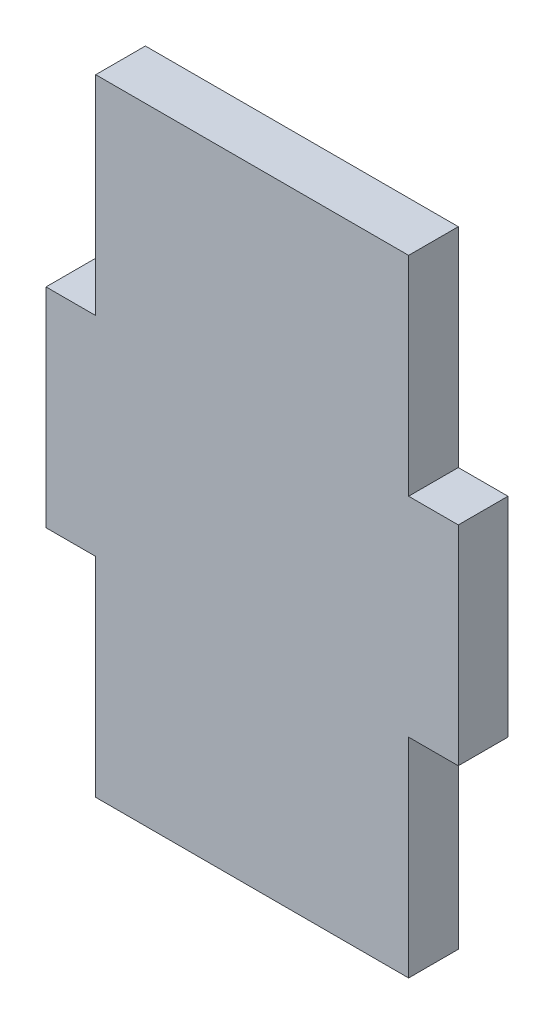
ISO-10303-21;
HEADER;
FILE_DESCRIPTION(('STEP AP214'),'2;1');
FILE_NAME('part.step','',(''),(''),'','','');
FILE_SCHEMA(('AUTOMOTIVE_DESIGN { 1 0 10303 214 1 1 1 1 }'));
ENDSEC;
DATA;
#1=APPLICATION_CONTEXT('core data for automotive mechanical design processes');
#2=APPLICATION_PROTOCOL_DEFINITION('international standard','automotive_design',2000,#1);
#3=PRODUCT_CONTEXT('',#1,'mechanical');
#4=PRODUCT('Part','Part','',(#3));
#5=PRODUCT_RELATED_PRODUCT_CATEGORY('part','',(#4));
#6=PRODUCT_DEFINITION_FORMATION('','',#4);
#7=PRODUCT_DEFINITION_CONTEXT('part definition',#1,'design');
#8=PRODUCT_DEFINITION('design','',#6,#7);
#9=PRODUCT_DEFINITION_SHAPE('','',#8);
#10=(LENGTH_UNIT() NAMED_UNIT(*) SI_UNIT(.MILLI.,.METRE.));
#11=(NAMED_UNIT(*) PLANE_ANGLE_UNIT() SI_UNIT($,.RADIAN.));
#12=(NAMED_UNIT(*) SI_UNIT($,.STERADIAN.) SOLID_ANGLE_UNIT());
#13=UNCERTAINTY_MEASURE_WITH_UNIT(LENGTH_MEASURE(1.E-05),#10,'distance_accuracy_value','');
#14=(GEOMETRIC_REPRESENTATION_CONTEXT(3) GLOBAL_UNCERTAINTY_ASSIGNED_CONTEXT((#13)) GLOBAL_UNIT_ASSIGNED_CONTEXT((#10,
#11,#12)) REPRESENTATION_CONTEXT('',''));
#15=CARTESIAN_POINT('',(0.,0.,0.));
#16=DIRECTION('',(0.,0.,1.));
#17=DIRECTION('',(1.,0.,0.));
#18=AXIS2_PLACEMENT_3D('',#15,#16,#17);
#19=CARTESIAN_POINT('',(0.,0.,3.175));
#20=DIRECTION('',(1.,0.,0.));
#21=DIRECTION('',(0.,0.,-1.));
#22=AXIS2_PLACEMENT_3D('',#19,#20,#21);
#23=PLANE('',#22);
#24=DIRECTION('',(0.,-1.,0.));
#25=VECTOR('',#24,1.);
#26=CARTESIAN_POINT('',(0.,0.,0.));
#27=LINE('',#26,#25);
#28=CARTESIAN_POINT('',(0.,13.3333333333333,0.));
#29=VERTEX_POINT('',#28);
#30=CARTESIAN_POINT('',(0.,0.,0.));
#31=VERTEX_POINT('',#30);
#32=EDGE_CURVE('E153',#29,#31,#27,.T.);
#33=ORIENTED_EDGE('',*,*,#32,.T.);
#34=DIRECTION('',(0.,0.,-1.));
#35=VECTOR('',#34,1.);
#36=CARTESIAN_POINT('',(0.,0.,3.175));
#37=LINE('',#36,#35);
#38=CARTESIAN_POINT('',(0.,0.,3.175));
#39=VERTEX_POINT('',#38);
#40=EDGE_CURVE('E11',#39,#31,#37,.T.);
#41=ORIENTED_EDGE('',*,*,#40,.F.);
#42=DIRECTION('',(0.,-1.,0.));
#43=VECTOR('',#42,1.);
#44=CARTESIAN_POINT('',(0.,0.,3.175));
#45=LINE('',#44,#43);
#46=CARTESIAN_POINT('',(0.,13.3333333333333,3.175));
#47=VERTEX_POINT('',#46);
#48=EDGE_CURVE('E175',#47,#39,#45,.T.);
#49=ORIENTED_EDGE('',*,*,#48,.F.);
#50=DIRECTION('',(0.,0.,-1.));
#51=VECTOR('',#50,1.);
#52=CARTESIAN_POINT('',(0.,13.3333333333333,3.175));
#53=LINE('',#52,#51);
#54=EDGE_CURVE('E149',#47,#29,#53,.T.);
#55=ORIENTED_EDGE('',*,*,#54,.T.);
#56=EDGE_LOOP('',(#33,#41,#49,#55));
#57=FACE_BOUND('',#56,.T.);
#58=ADVANCED_FACE('F33',(#57),#23,.F.);
#59=CARTESIAN_POINT('',(0.,0.,3.175));
#60=DIRECTION('',(0.,1.,0.));
#61=DIRECTION('',(0.,0.,1.));
#62=AXIS2_PLACEMENT_3D('',#59,#60,#61);
#63=PLANE('',#62);
#64=DIRECTION('',(1.,0.,0.));
#65=VECTOR('',#64,1.);
#66=CARTESIAN_POINT('',(0.,0.,0.));
#67=LINE('',#66,#65);
#68=CARTESIAN_POINT('',(20.,0.,0.));
#69=VERTEX_POINT('',#68);
#70=EDGE_CURVE('E156',#31,#69,#67,.T.);
#71=ORIENTED_EDGE('',*,*,#70,.T.);
#72=DIRECTION('',(0.,0.,-1.));
#73=VECTOR('',#72,1.);
#74=CARTESIAN_POINT('',(20.,0.,3.175));
#75=LINE('',#74,#73);
#76=CARTESIAN_POINT('',(20.,0.,3.175));
#77=VERTEX_POINT('',#76);
#78=EDGE_CURVE('E41',#77,#69,#75,.T.);
#79=ORIENTED_EDGE('',*,*,#78,.F.);
#80=DIRECTION('',(1.,0.,0.));
#81=VECTOR('',#80,1.);
#82=CARTESIAN_POINT('',(0.,0.,3.175));
#83=LINE('',#82,#81);
#84=EDGE_CURVE('E104',#39,#77,#83,.T.);
#85=ORIENTED_EDGE('',*,*,#84,.F.);
#86=ORIENTED_EDGE('',*,*,#40,.T.);
#87=EDGE_LOOP('',(#71,#79,#85,#86));
#88=FACE_BOUND('',#87,.T.);
#89=ADVANCED_FACE('F253',(#88),#63,.F.);
#90=CARTESIAN_POINT('',(20.,0.,3.175));
#91=DIRECTION('',(-1.,0.,0.));
#92=DIRECTION('',(0.,0.,1.));
#93=AXIS2_PLACEMENT_3D('',#90,#91,#92);
#94=PLANE('',#93);
#95=DIRECTION('',(0.,1.,0.));
#96=VECTOR('',#95,1.);
#97=CARTESIAN_POINT('',(20.,0.,0.));
#98=LINE('',#97,#96);
#99=CARTESIAN_POINT('',(20.,13.3333333333333,0.));
#100=VERTEX_POINT('',#99);
#101=EDGE_CURVE('E158',#69,#100,#98,.T.);
#102=ORIENTED_EDGE('',*,*,#101,.T.);
#103=DIRECTION('',(0.,0.,-1.));
#104=VECTOR('',#103,1.);
#105=CARTESIAN_POINT('',(20.,13.3333333333333,3.175));
#106=LINE('',#105,#104);
#107=CARTESIAN_POINT('',(20.,13.3333333333333,3.175));
#108=VERTEX_POINT('',#107);
#109=EDGE_CURVE('E194',#108,#100,#106,.T.);
#110=ORIENTED_EDGE('',*,*,#109,.F.);
#111=DIRECTION('',(0.,1.,0.));
#112=VECTOR('',#111,1.);
#113=CARTESIAN_POINT('',(20.,0.,3.175));
#114=LINE('',#113,#112);
#115=EDGE_CURVE('E202',#77,#108,#114,.T.);
#116=ORIENTED_EDGE('',*,*,#115,.F.);
#117=ORIENTED_EDGE('',*,*,#78,.T.);
#118=EDGE_LOOP('',(#102,#110,#116,#117));
#119=FACE_BOUND('',#118,.T.);
#120=ADVANCED_FACE('F200',(#119),#94,.F.);
#121=CARTESIAN_POINT('',(23.175,13.3333333333333,3.175));
#122=DIRECTION('',(0.,1.,0.));
#123=DIRECTION('',(-1.,0.,0.));
#124=AXIS2_PLACEMENT_3D('',#121,#122,#123);
#125=PLANE('',#124);
#126=DIRECTION('',(1.,0.,0.));
#127=VECTOR('',#126,1.);
#128=CARTESIAN_POINT('',(23.175,13.3333333333333,0.));
#129=LINE('',#128,#127);
#130=CARTESIAN_POINT('',(23.175,13.3333333333333,0.));
#131=VERTEX_POINT('',#130);
#132=EDGE_CURVE('E160',#100,#131,#129,.T.);
#133=ORIENTED_EDGE('',*,*,#132,.T.);
#134=DIRECTION('',(0.,0.,-1.));
#135=VECTOR('',#134,1.);
#136=CARTESIAN_POINT('',(23.175,13.3333333333333,3.175));
#137=LINE('',#136,#135);
#138=CARTESIAN_POINT('',(23.175,13.3333333333333,3.175));
#139=VERTEX_POINT('',#138);
#140=EDGE_CURVE('E191',#139,#131,#137,.T.);
#141=ORIENTED_EDGE('',*,*,#140,.F.);
#142=DIRECTION('',(1.,0.,0.));
#143=VECTOR('',#142,1.);
#144=CARTESIAN_POINT('',(23.175,13.3333333333333,3.175));
#145=LINE('',#144,#143);
#146=EDGE_CURVE('E220',#108,#139,#145,.T.);
#147=ORIENTED_EDGE('',*,*,#146,.F.);
#148=ORIENTED_EDGE('',*,*,#109,.T.);
#149=EDGE_LOOP('',(#133,#141,#147,#148));
#150=FACE_BOUND('',#149,.T.);
#151=ADVANCED_FACE('F211',(#150),#125,.F.);
#152=CARTESIAN_POINT('',(23.175,26.6666666666667,3.175));
#153=DIRECTION('',(-1.,0.,0.));
#154=DIRECTION('',(0.,0.,1.));
#155=AXIS2_PLACEMENT_3D('',#152,#153,#154);
#156=PLANE('',#155);
#157=DIRECTION('',(0.,1.,0.));
#158=VECTOR('',#157,1.);
#159=CARTESIAN_POINT('',(23.175,26.6666666666667,0.));
#160=LINE('',#159,#158);
#161=CARTESIAN_POINT('',(23.175,26.6666666666667,0.));
#162=VERTEX_POINT('',#161);
#163=EDGE_CURVE('E162',#131,#162,#160,.T.);
#164=ORIENTED_EDGE('',*,*,#163,.T.);
#165=DIRECTION('',(0.,0.,-1.));
#166=VECTOR('',#165,1.);
#167=CARTESIAN_POINT('',(23.175,26.6666666666667,3.175));
#168=LINE('',#167,#166);
#169=CARTESIAN_POINT('',(23.175,26.6666666666667,3.175));
#170=VERTEX_POINT('',#169);
#171=EDGE_CURVE('E188',#170,#162,#168,.T.);
#172=ORIENTED_EDGE('',*,*,#171,.F.);
#173=DIRECTION('',(0.,1.,0.));
#174=VECTOR('',#173,1.);
#175=CARTESIAN_POINT('',(23.175,26.6666666666667,3.175));
#176=LINE('',#175,#174);
#177=EDGE_CURVE('E217',#139,#170,#176,.T.);
#178=ORIENTED_EDGE('',*,*,#177,.F.);
#179=ORIENTED_EDGE('',*,*,#140,.T.);
#180=EDGE_LOOP('',(#164,#172,#178,#179));
#181=FACE_BOUND('',#180,.T.);
#182=ADVANCED_FACE('F215',(#181),#156,.F.);
#183=CARTESIAN_POINT('',(20.,26.6666666666667,3.175));
#184=DIRECTION('',(0.,-1.,0.));
#185=DIRECTION('',(0.,0.,-1.));
#186=AXIS2_PLACEMENT_3D('',#183,#184,#185);
#187=PLANE('',#186);
#188=DIRECTION('',(-1.,0.,0.));
#189=VECTOR('',#188,1.);
#190=CARTESIAN_POINT('',(20.,26.6666666666667,0.));
#191=LINE('',#190,#189);
#192=CARTESIAN_POINT('',(20.,26.6666666666667,0.));
#193=VERTEX_POINT('',#192);
#194=EDGE_CURVE('E164',#162,#193,#191,.T.);
#195=ORIENTED_EDGE('',*,*,#194,.T.);
#196=DIRECTION('',(0.,0.,-1.));
#197=VECTOR('',#196,1.);
#198=CARTESIAN_POINT('',(20.,26.6666666666667,3.175));
#199=LINE('',#198,#197);
#200=CARTESIAN_POINT('',(20.,26.6666666666667,3.175));
#201=VERTEX_POINT('',#200);
#202=EDGE_CURVE('E185',#201,#193,#199,.T.);
#203=ORIENTED_EDGE('',*,*,#202,.F.);
#204=DIRECTION('',(-1.,0.,0.));
#205=VECTOR('',#204,1.);
#206=CARTESIAN_POINT('',(20.,26.6666666666667,3.175));
#207=LINE('',#206,#205);
#208=EDGE_CURVE('E219',#170,#201,#207,.T.);
#209=ORIENTED_EDGE('',*,*,#208,.F.);
#210=ORIENTED_EDGE('',*,*,#171,.T.);
#211=EDGE_LOOP('',(#195,#203,#209,#210));
#212=FACE_BOUND('',#211,.T.);
#213=ADVANCED_FACE('F266',(#212),#187,.F.);
#214=CARTESIAN_POINT('',(20.,26.6666666666667,3.175));
#215=DIRECTION('',(-1.,0.,0.));
#216=DIRECTION('',(0.,0.,1.));
#217=AXIS2_PLACEMENT_3D('',#214,#215,#216);
#218=PLANE('',#217);
#219=DIRECTION('',(0.,1.,0.));
#220=VECTOR('',#219,1.);
#221=CARTESIAN_POINT('',(20.,26.6666666666667,0.));
#222=LINE('',#221,#220);
#223=CARTESIAN_POINT('',(20.,40.,0.));
#224=VERTEX_POINT('',#223);
#225=EDGE_CURVE('E166',#193,#224,#222,.T.);
#226=ORIENTED_EDGE('',*,*,#225,.T.);
#227=DIRECTION('',(0.,0.,-1.));
#228=VECTOR('',#227,1.);
#229=CARTESIAN_POINT('',(20.,40.,3.175));
#230=LINE('',#229,#228);
#231=CARTESIAN_POINT('',(20.,40.,3.175));
#232=VERTEX_POINT('',#231);
#233=EDGE_CURVE('E182',#232,#224,#230,.T.);
#234=ORIENTED_EDGE('',*,*,#233,.F.);
#235=DIRECTION('',(0.,1.,0.));
#236=VECTOR('',#235,1.);
#237=CARTESIAN_POINT('',(20.,26.6666666666667,3.175));
#238=LINE('',#237,#236);
#239=EDGE_CURVE('E222',#201,#232,#238,.T.);
#240=ORIENTED_EDGE('',*,*,#239,.F.);
#241=ORIENTED_EDGE('',*,*,#202,.T.);
#242=EDGE_LOOP('',(#226,#234,#240,#241));
#243=FACE_BOUND('',#242,.T.);
#244=ADVANCED_FACE('F269',(#243),#218,.F.);
#245=CARTESIAN_POINT('',(0.,40.,3.175));
#246=DIRECTION('',(0.,-1.,0.));
#247=DIRECTION('',(1.,0.,0.));
#248=AXIS2_PLACEMENT_3D('',#245,#246,#247);
#249=PLANE('',#248);
#250=DIRECTION('',(-1.,0.,0.));
#251=VECTOR('',#250,1.);
#252=CARTESIAN_POINT('',(0.,40.,0.));
#253=LINE('',#252,#251);
#254=CARTESIAN_POINT('',(0.,40.,0.));
#255=VERTEX_POINT('',#254);
#256=EDGE_CURVE('E168',#224,#255,#253,.T.);
#257=ORIENTED_EDGE('',*,*,#256,.T.);
#258=DIRECTION('',(0.,0.,-1.));
#259=VECTOR('',#258,1.);
#260=CARTESIAN_POINT('',(0.,40.,3.175));
#261=LINE('',#260,#259);
#262=CARTESIAN_POINT('',(0.,40.,3.175));
#263=VERTEX_POINT('',#262);
#264=EDGE_CURVE('E179',#263,#255,#261,.T.);
#265=ORIENTED_EDGE('',*,*,#264,.F.);
#266=DIRECTION('',(-1.,0.,0.));
#267=VECTOR('',#266,1.);
#268=CARTESIAN_POINT('',(0.,40.,3.175));
#269=LINE('',#268,#267);
#270=EDGE_CURVE('E228',#232,#263,#269,.T.);
#271=ORIENTED_EDGE('',*,*,#270,.F.);
#272=ORIENTED_EDGE('',*,*,#233,.T.);
#273=EDGE_LOOP('',(#257,#265,#271,#272));
#274=FACE_BOUND('',#273,.T.);
#275=ADVANCED_FACE('F234',(#274),#249,.F.);
#276=CARTESIAN_POINT('',(0.,26.6666666666667,3.175));
#277=DIRECTION('',(1.,0.,0.));
#278=DIRECTION('',(0.,0.,-1.));
#279=AXIS2_PLACEMENT_3D('',#276,#277,#278);
#280=PLANE('',#279);
#281=DIRECTION('',(0.,-1.,0.));
#282=VECTOR('',#281,1.);
#283=CARTESIAN_POINT('',(0.,26.6666666666667,0.));
#284=LINE('',#283,#282);
#285=CARTESIAN_POINT('',(0.,26.6666666666667,0.));
#286=VERTEX_POINT('',#285);
#287=EDGE_CURVE('E170',#255,#286,#284,.T.);
#288=ORIENTED_EDGE('',*,*,#287,.T.);
#289=DIRECTION('',(0.,0.,-1.));
#290=VECTOR('',#289,1.);
#291=CARTESIAN_POINT('',(0.,26.6666666666667,3.175));
#292=LINE('',#291,#290);
#293=CARTESIAN_POINT('',(0.,26.6666666666667,3.175));
#294=VERTEX_POINT('',#293);
#295=EDGE_CURVE('E144',#294,#286,#292,.T.);
#296=ORIENTED_EDGE('',*,*,#295,.F.);
#297=DIRECTION('',(0.,-1.,0.));
#298=VECTOR('',#297,1.);
#299=CARTESIAN_POINT('',(0.,26.6666666666667,3.175));
#300=LINE('',#299,#298);
#301=EDGE_CURVE('E135',#263,#294,#300,.T.);
#302=ORIENTED_EDGE('',*,*,#301,.F.);
#303=ORIENTED_EDGE('',*,*,#264,.T.);
#304=EDGE_LOOP('',(#288,#296,#302,#303));
#305=FACE_BOUND('',#304,.T.);
#306=ADVANCED_FACE('F238',(#305),#280,.F.);
#307=CARTESIAN_POINT('',(0.,26.6666666666667,3.175));
#308=DIRECTION('',(0.,-1.,0.));
#309=DIRECTION('',(0.,0.,-1.));
#310=AXIS2_PLACEMENT_3D('',#307,#308,#309);
#311=PLANE('',#310);
#312=DIRECTION('',(-1.,0.,0.));
#313=VECTOR('',#312,1.);
#314=CARTESIAN_POINT('',(0.,26.6666666666667,0.));
#315=LINE('',#314,#313);
#316=CARTESIAN_POINT('',(-3.175,26.6666666666667,0.));
#317=VERTEX_POINT('',#316);
#318=EDGE_CURVE('E143',#286,#317,#315,.T.);
#319=ORIENTED_EDGE('',*,*,#318,.T.);
#320=DIRECTION('',(0.,0.,-1.));
#321=VECTOR('',#320,1.);
#322=CARTESIAN_POINT('',(-3.175,26.6666666666667,3.175));
#323=LINE('',#322,#321);
#324=CARTESIAN_POINT('',(-3.175,26.6666666666667,3.175));
#325=VERTEX_POINT('',#324);
#326=EDGE_CURVE('E140',#325,#317,#323,.T.);
#327=ORIENTED_EDGE('',*,*,#326,.F.);
#328=DIRECTION('',(-1.,0.,0.));
#329=VECTOR('',#328,1.);
#330=CARTESIAN_POINT('',(0.,26.6666666666667,3.175));
#331=LINE('',#330,#329);
#332=EDGE_CURVE('E129',#294,#325,#331,.T.);
#333=ORIENTED_EDGE('',*,*,#332,.F.);
#334=ORIENTED_EDGE('',*,*,#295,.T.);
#335=EDGE_LOOP('',(#319,#327,#333,#334));
#336=FACE_BOUND('',#335,.T.);
#337=ADVANCED_FACE('F141',(#336),#311,.F.);
#338=CARTESIAN_POINT('',(-3.175,26.6666666666667,3.175));
#339=DIRECTION('',(1.,0.,0.));
#340=DIRECTION('',(0.,1.,0.));
#341=AXIS2_PLACEMENT_3D('',#338,#339,#340);
#342=PLANE('',#341);
#343=DIRECTION('',(0.,-1.,0.));
#344=VECTOR('',#343,1.);
#345=CARTESIAN_POINT('',(-3.175,26.6666666666667,0.));
#346=LINE('',#345,#344);
#347=CARTESIAN_POINT('',(-3.175,13.3333333333333,0.));
#348=VERTEX_POINT('',#347);
#349=EDGE_CURVE('E90',#317,#348,#346,.T.);
#350=ORIENTED_EDGE('',*,*,#349,.T.);
#351=DIRECTION('',(0.,0.,-1.));
#352=VECTOR('',#351,1.);
#353=CARTESIAN_POINT('',(-3.175,13.3333333333333,3.175));
#354=LINE('',#353,#352);
#355=CARTESIAN_POINT('',(-3.175,13.3333333333333,3.175));
#356=VERTEX_POINT('',#355);
#357=EDGE_CURVE('E145',#356,#348,#354,.T.);
#358=ORIENTED_EDGE('',*,*,#357,.F.);
#359=DIRECTION('',(0.,-1.,0.));
#360=VECTOR('',#359,1.);
#361=CARTESIAN_POINT('',(-3.175,26.6666666666667,3.175));
#362=LINE('',#361,#360);
#363=EDGE_CURVE('E133',#325,#356,#362,.T.);
#364=ORIENTED_EDGE('',*,*,#363,.F.);
#365=ORIENTED_EDGE('',*,*,#326,.T.);
#366=EDGE_LOOP('',(#350,#358,#364,#365));
#367=FACE_BOUND('',#366,.T.);
#368=ADVANCED_FACE('F147',(#367),#342,.F.);
#369=CARTESIAN_POINT('',(-3.175,13.3333333333333,3.175));
#370=DIRECTION('',(0.,1.,0.));
#371=DIRECTION('',(-1.,0.,0.));
#372=AXIS2_PLACEMENT_3D('',#369,#370,#371);
#373=PLANE('',#372);
#374=DIRECTION('',(1.,0.,0.));
#375=VECTOR('',#374,1.);
#376=CARTESIAN_POINT('',(-3.175,13.3333333333333,0.));
#377=LINE('',#376,#375);
#378=EDGE_CURVE('E96',#348,#29,#377,.T.);
#379=ORIENTED_EDGE('',*,*,#378,.T.);
#380=ORIENTED_EDGE('',*,*,#54,.F.);
#381=DIRECTION('',(1.,0.,0.));
#382=VECTOR('',#381,1.);
#383=CARTESIAN_POINT('',(-3.175,13.3333333333333,3.175));
#384=LINE('',#383,#382);
#385=EDGE_CURVE('E49',#356,#47,#384,.T.);
#386=ORIENTED_EDGE('',*,*,#385,.F.);
#387=ORIENTED_EDGE('',*,*,#357,.T.);
#388=EDGE_LOOP('',(#379,#380,#386,#387));
#389=FACE_BOUND('',#388,.T.);
#390=ADVANCED_FACE('F242',(#389),#373,.F.);
#391=CARTESIAN_POINT('',(0.,0.,3.175));
#392=DIRECTION('',(0.,0.,-1.));
#393=DIRECTION('',(-1.,0.,0.));
#394=AXIS2_PLACEMENT_3D('',#391,#392,#393);
#395=PLANE('',#394);
#396=ORIENTED_EDGE('',*,*,#48,.T.);
#397=ORIENTED_EDGE('',*,*,#84,.T.);
#398=ORIENTED_EDGE('',*,*,#115,.T.);
#399=ORIENTED_EDGE('',*,*,#146,.T.);
#400=ORIENTED_EDGE('',*,*,#177,.T.);
#401=ORIENTED_EDGE('',*,*,#208,.T.);
#402=ORIENTED_EDGE('',*,*,#239,.T.);
#403=ORIENTED_EDGE('',*,*,#270,.T.);
#404=ORIENTED_EDGE('',*,*,#301,.T.);
#405=ORIENTED_EDGE('',*,*,#332,.T.);
#406=ORIENTED_EDGE('',*,*,#363,.T.);
#407=ORIENTED_EDGE('',*,*,#385,.T.);
#408=EDGE_LOOP('',(#396,#397,#398,#399,#400,#401,#402,#403,#404,#405,#406,#407));
#409=FACE_BOUND('',#408,.T.);
#410=ADVANCED_FACE('F131',(#409),#395,.F.);
#411=CARTESIAN_POINT('',(0.,0.,0.));
#412=DIRECTION('',(0.,0.,-1.));
#413=DIRECTION('',(-1.,0.,0.));
#414=AXIS2_PLACEMENT_3D('',#411,#412,#413);
#415=PLANE('',#414);
#416=ORIENTED_EDGE('',*,*,#32,.F.);
#417=ORIENTED_EDGE('',*,*,#378,.F.);
#418=ORIENTED_EDGE('',*,*,#349,.F.);
#419=ORIENTED_EDGE('',*,*,#318,.F.);
#420=ORIENTED_EDGE('',*,*,#287,.F.);
#421=ORIENTED_EDGE('',*,*,#256,.F.);
#422=ORIENTED_EDGE('',*,*,#225,.F.);
#423=ORIENTED_EDGE('',*,*,#194,.F.);
#424=ORIENTED_EDGE('',*,*,#163,.F.);
#425=ORIENTED_EDGE('',*,*,#132,.F.);
#426=ORIENTED_EDGE('',*,*,#101,.F.);
#427=ORIENTED_EDGE('',*,*,#70,.F.);
#428=EDGE_LOOP('',(#416,#417,#418,#419,#420,#421,#422,#423,#424,#425,#426,#427));
#429=FACE_BOUND('',#428,.T.);
#430=ADVANCED_FACE('F206',(#429),#415,.T.);
#431=CLOSED_SHELL('',(#58,#89,#120,#151,#182,#213,#244,#275,#306,#337,#368,#390,#410,#430));
#432=MANIFOLD_SOLID_BREP('B2',#431);
#433=ADVANCED_BREP_SHAPE_REPRESENTATION('',(#18,#432),#14);
#434=SHAPE_DEFINITION_REPRESENTATION(#9,#433);
ENDSEC;
END-ISO-10303-21;
